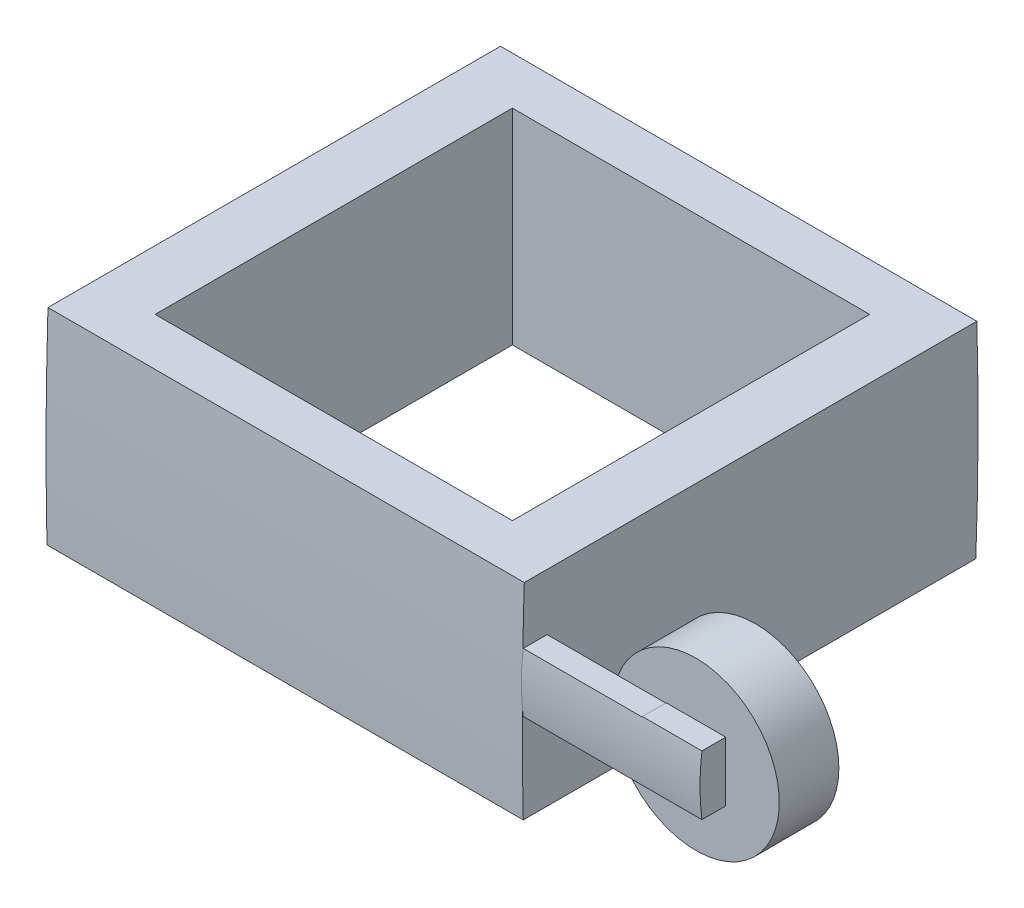
ISO-10303-21;
HEADER;
FILE_DESCRIPTION(('STEP AP214'),'2;1');
FILE_NAME('part.step','',(''),(''),'','','');
FILE_SCHEMA(('AUTOMOTIVE_DESIGN { 1 0 10303 214 1 1 1 1 }'));
ENDSEC;
DATA;
#1=APPLICATION_CONTEXT('core data for automotive mechanical design processes');
#2=APPLICATION_PROTOCOL_DEFINITION('international standard','automotive_design',2000,#1);
#3=PRODUCT_CONTEXT('',#1,'mechanical');
#4=PRODUCT('Part','Part','',(#3));
#5=PRODUCT_RELATED_PRODUCT_CATEGORY('part','',(#4));
#6=PRODUCT_DEFINITION_FORMATION('','',#4);
#7=PRODUCT_DEFINITION_CONTEXT('part definition',#1,'design');
#8=PRODUCT_DEFINITION('design','',#6,#7);
#9=PRODUCT_DEFINITION_SHAPE('','',#8);
#10=(LENGTH_UNIT() NAMED_UNIT(*) SI_UNIT(.MILLI.,.METRE.));
#11=(NAMED_UNIT(*) PLANE_ANGLE_UNIT() SI_UNIT($,.RADIAN.));
#12=(NAMED_UNIT(*) SI_UNIT($,.STERADIAN.) SOLID_ANGLE_UNIT());
#13=UNCERTAINTY_MEASURE_WITH_UNIT(LENGTH_MEASURE(1.E-05),#10,'distance_accuracy_value','');
#14=(GEOMETRIC_REPRESENTATION_CONTEXT(3) GLOBAL_UNCERTAINTY_ASSIGNED_CONTEXT((#13)) GLOBAL_UNIT_ASSIGNED_CONTEXT((#10,
#11,#12)) REPRESENTATION_CONTEXT('',''));
#15=CARTESIAN_POINT('',(0.,0.,0.));
#16=DIRECTION('',(0.,0.,1.));
#17=DIRECTION('',(1.,0.,0.));
#18=AXIS2_PLACEMENT_3D('',#15,#16,#17);
#19=CARTESIAN_POINT('',(0.,0.,10.));
#20=DIRECTION('',(0.,0.,1.));
#21=DIRECTION('',(1.,0.,0.));
#22=AXIS2_PLACEMENT_3D('',#19,#20,#21);
#23=PLANE('',#22);
#24=DIRECTION('',(1.,0.,0.));
#25=VECTOR('',#24,1.);
#26=CARTESIAN_POINT('',(-5.,-5.,10.));
#27=LINE('',#26,#25);
#28=CARTESIAN_POINT('',(-13.076696830622,-5.,10.));
#29=VERTEX_POINT('',#28);
#30=CARTESIAN_POINT('',(5.,-5.,10.));
#31=VERTEX_POINT('',#30);
#32=EDGE_CURVE('E260',#29,#31,#27,.T.);
#33=ORIENTED_EDGE('',*,*,#32,.F.);
#34=CARTESIAN_POINT('',(0.,0.,10.));
#35=DIRECTION('',(0.,0.,1.));
#36=DIRECTION('',(1.,0.,0.));
#37=AXIS2_PLACEMENT_3D('',#34,#35,#36);
#38=CIRCLE('',#37,14.);
#39=CARTESIAN_POINT('',(-13.1096817143984,4.91286528892942,10.));
#40=VERTEX_POINT('',#39);
#41=EDGE_CURVE('E280',#29,#40,#38,.T.);
#42=ORIENTED_EDGE('',*,*,#41,.T.);
#43=DIRECTION('',(1.,0.,0.));
#44=VECTOR('',#43,1.);
#45=CARTESIAN_POINT('',(-25.,4.91286528892942,10.));
#46=LINE('',#45,#44);
#47=CARTESIAN_POINT('',(-5.,4.91286528892942,10.));
#48=VERTEX_POINT('',#47);
#49=EDGE_CURVE('E243',#40,#48,#46,.T.);
#50=ORIENTED_EDGE('',*,*,#49,.T.);
#51=DIRECTION('',(0.,-1.,0.));
#52=VECTOR('',#51,1.);
#53=CARTESIAN_POINT('',(-5.,5.,10.));
#54=LINE('',#53,#52);
#55=CARTESIAN_POINT('',(-5.,5.,10.));
#56=VERTEX_POINT('',#55);
#57=EDGE_CURVE('E257',#56,#48,#54,.T.);
#58=ORIENTED_EDGE('',*,*,#57,.F.);
#59=DIRECTION('',(-1.,0.,0.));
#60=VECTOR('',#59,1.);
#61=CARTESIAN_POINT('',(-5.,5.,10.));
#62=LINE('',#61,#60);
#63=CARTESIAN_POINT('',(5.,5.,10.));
#64=VERTEX_POINT('',#63);
#65=EDGE_CURVE('E254',#64,#56,#62,.T.);
#66=ORIENTED_EDGE('',*,*,#65,.F.);
#67=DIRECTION('',(0.,1.,0.));
#68=VECTOR('',#67,1.);
#69=CARTESIAN_POINT('',(5.,5.,10.));
#70=LINE('',#69,#68);
#71=EDGE_CURVE('E251',#31,#64,#70,.T.);
#72=ORIENTED_EDGE('',*,*,#71,.F.);
#73=EDGE_LOOP('',(#33,#42,#50,#58,#66,#72));
#74=FACE_BOUND('',#73,.T.);
#75=ADVANCED_FACE('F32',(#74),#23,.T.);
#76=CARTESIAN_POINT('',(-5.,5.,18.));
#77=DIRECTION('',(1.,0.,0.));
#78=DIRECTION('',(0.,1.,0.));
#79=AXIS2_PLACEMENT_3D('',#76,#77,#78);
#80=PLANE('',#79);
#81=DIRECTION('',(0.,0.,-1.));
#82=VECTOR('',#81,1.);
#83=CARTESIAN_POINT('',(-5.,4.91286528892942,10.));
#84=LINE('',#83,#82);
#85=CARTESIAN_POINT('',(-5.,4.91286528892942,14.0114631277404));
#86=VERTEX_POINT('',#85);
#87=EDGE_CURVE('E233',#86,#48,#84,.T.);
#88=ORIENTED_EDGE('',*,*,#87,.F.);
#89=CARTESIAN_POINT('',(-5.,0.,-23.6696164036747));
#90=DIRECTION('',(1.,0.,0.));
#91=DIRECTION('',(0.,1.,0.));
#92=AXIS2_PLACEMENT_3D('',#89,#90,#91);
#93=CIRCLE('',#92,38.);
#94=CARTESIAN_POINT('',(-5.,5.,14.));
#95=VERTEX_POINT('',#94);
#96=EDGE_CURVE('E230',#86,#95,#93,.F.);
#97=ORIENTED_EDGE('',*,*,#96,.T.);
#98=DIRECTION('',(0.,0.,-1.));
#99=VECTOR('',#98,1.);
#100=CARTESIAN_POINT('',(-5.,5.,18.));
#101=LINE('',#100,#99);
#102=EDGE_CURVE('E265',#95,#56,#101,.T.);
#103=ORIENTED_EDGE('',*,*,#102,.T.);
#104=ORIENTED_EDGE('',*,*,#57,.T.);
#105=EDGE_LOOP('',(#88,#97,#103,#104));
#106=FACE_BOUND('',#105,.T.);
#107=ADVANCED_FACE('F311',(#106),#80,.F.);
#108=CARTESIAN_POINT('',(0.,0.,10.));
#109=DIRECTION('',(0.,0.,-1.));
#110=DIRECTION('',(-1.,0.,0.));
#111=AXIS2_PLACEMENT_3D('',#108,#109,#110);
#112=CYLINDRICAL_SURFACE('',#111,14.);
#113=EDGE_CURVE('E41',#40,#29,#38,.T.);
#114=ORIENTED_EDGE('',*,*,#113,.F.);
#115=ORIENTED_EDGE('',*,*,#41,.F.);
#116=EDGE_LOOP('',(#114,#115));
#117=FACE_BOUND('',#116,.T.);
#118=CARTESIAN_POINT('',(0.,0.,0.));
#119=DIRECTION('',(0.,0.,1.));
#120=DIRECTION('',(1.,0.,0.));
#121=AXIS2_PLACEMENT_3D('',#118,#119,#120);
#122=CIRCLE('',#121,14.);
#123=CARTESIAN_POINT('',(14.,0.,0.));
#124=VERTEX_POINT('',#123);
#125=EDGE_CURVE('E278',#124,#124,#122,.T.);
#126=ORIENTED_EDGE('',*,*,#125,.T.);
#127=EDGE_LOOP('',(#126));
#128=FACE_BOUND('',#127,.T.);
#129=ADVANCED_FACE('F34',(#117,#128),#112,.T.);
#130=CARTESIAN_POINT('',(0.,0.,0.));
#131=DIRECTION('',(0.,0.,1.));
#132=DIRECTION('',(1.,0.,0.));
#133=AXIS2_PLACEMENT_3D('',#130,#131,#132);
#134=PLANE('',#133);
#135=CARTESIAN_POINT('',(0.,0.,0.));
#136=DIRECTION('',(0.,0.,-1.));
#137=DIRECTION('',(-1.,0.,0.));
#138=AXIS2_PLACEMENT_3D('',#135,#136,#137);
#139=CIRCLE('',#138,5.);
#140=CARTESIAN_POINT('',(-5.,0.,0.));
#141=VERTEX_POINT('',#140);
#142=EDGE_CURVE('E269',#141,#141,#139,.T.);
#143=ORIENTED_EDGE('',*,*,#142,.F.);
#144=EDGE_LOOP('',(#143));
#145=FACE_BOUND('',#144,.T.);
#146=ORIENTED_EDGE('',*,*,#125,.F.);
#147=EDGE_LOOP('',(#146));
#148=FACE_BOUND('',#147,.T.);
#149=ADVANCED_FACE('F361',(#145,#148),#134,.F.);
#150=CARTESIAN_POINT('',(0.,0.,1.8));
#151=DIRECTION('',(0.,0.,-1.));
#152=DIRECTION('',(-1.,0.,0.));
#153=AXIS2_PLACEMENT_3D('',#150,#151,#152);
#154=PLANE('',#153);
#155=CARTESIAN_POINT('',(0.,0.,1.8));
#156=DIRECTION('',(0.,0.,-1.));
#157=DIRECTION('',(-1.,0.,0.));
#158=AXIS2_PLACEMENT_3D('',#155,#156,#157);
#159=CIRCLE('',#158,5.);
#160=CARTESIAN_POINT('',(-5.,0.,1.8));
#161=VERTEX_POINT('',#160);
#162=EDGE_CURVE('E270',#161,#161,#159,.T.);
#163=ORIENTED_EDGE('',*,*,#162,.T.);
#164=EDGE_LOOP('',(#163));
#165=FACE_BOUND('',#164,.T.);
#166=CARTESIAN_POINT('',(0.,0.,1.8));
#167=DIRECTION('',(0.,0.,-1.));
#168=DIRECTION('',(-1.,0.,0.));
#169=AXIS2_PLACEMENT_3D('',#166,#167,#168);
#170=CIRCLE('',#169,2.25);
#171=CARTESIAN_POINT('',(-2.25,0.,1.8));
#172=VERTEX_POINT('',#171);
#173=EDGE_CURVE('E36',#172,#172,#170,.F.);
#174=ORIENTED_EDGE('',*,*,#173,.T.);
#175=EDGE_LOOP('',(#174));
#176=FACE_BOUND('',#175,.T.);
#177=ADVANCED_FACE('F363',(#165,#176),#154,.T.);
#178=CARTESIAN_POINT('',(0.,0.,1.8));
#179=DIRECTION('',(0.,0.,-1.));
#180=DIRECTION('',(-1.,0.,0.));
#181=AXIS2_PLACEMENT_3D('',#178,#179,#180);
#182=CYLINDRICAL_SURFACE('',#181,5.);
#183=ORIENTED_EDGE('',*,*,#162,.F.);
#184=EDGE_LOOP('',(#183));
#185=FACE_BOUND('',#184,.T.);
#186=ORIENTED_EDGE('',*,*,#142,.T.);
#187=EDGE_LOOP('',(#186));
#188=FACE_BOUND('',#187,.T.);
#189=ADVANCED_FACE('F369',(#185,#188),#182,.F.);
#190=CARTESIAN_POINT('',(0.,0.,5.));
#191=DIRECTION('',(0.,0.,-1.));
#192=DIRECTION('',(-1.,0.,0.));
#193=AXIS2_PLACEMENT_3D('',#190,#191,#192);
#194=PLANE('',#193);
#195=CARTESIAN_POINT('',(0.,0.,5.));
#196=DIRECTION('',(0.,0.,-1.));
#197=DIRECTION('',(-1.,0.,0.));
#198=AXIS2_PLACEMENT_3D('',#195,#196,#197);
#199=CIRCLE('',#198,2.25);
#200=CARTESIAN_POINT('',(-2.25,0.,5.));
#201=VERTEX_POINT('',#200);
#202=EDGE_CURVE('E275',#201,#201,#199,.T.);
#203=ORIENTED_EDGE('',*,*,#202,.T.);
#204=EDGE_LOOP('',(#203));
#205=FACE_BOUND('',#204,.T.);
#206=ADVANCED_FACE('F376',(#205),#194,.T.);
#207=CARTESIAN_POINT('',(0.,0.,5.));
#208=DIRECTION('',(0.,0.,-1.));
#209=DIRECTION('',(-1.,0.,0.));
#210=AXIS2_PLACEMENT_3D('',#207,#208,#209);
#211=CYLINDRICAL_SURFACE('',#210,2.25);
#212=ORIENTED_EDGE('',*,*,#202,.F.);
#213=EDGE_LOOP('',(#212));
#214=FACE_BOUND('',#213,.T.);
#215=ORIENTED_EDGE('',*,*,#173,.F.);
#216=EDGE_LOOP('',(#215));
#217=FACE_BOUND('',#216,.T.);
#218=ADVANCED_FACE('F359',(#214,#217),#211,.F.);
#219=CARTESIAN_POINT('',(5.,5.,18.));
#220=DIRECTION('',(-1.,0.,0.));
#221=DIRECTION('',(0.,-1.,0.));
#222=AXIS2_PLACEMENT_3D('',#219,#220,#221);
#223=PLANE('',#222);
#224=DIRECTION('',(0.,0.,-1.));
#225=VECTOR('',#224,1.);
#226=CARTESIAN_POINT('',(5.,5.,18.));
#227=LINE('',#226,#225);
#228=CARTESIAN_POINT('',(5.,5.,14.));
#229=VERTEX_POINT('',#228);
#230=EDGE_CURVE('E267',#229,#64,#227,.T.);
#231=ORIENTED_EDGE('',*,*,#230,.F.);
#232=CARTESIAN_POINT('',(5.,0.,-23.6696164036747));
#233=DIRECTION('',(-1.,0.,0.));
#234=DIRECTION('',(0.,-1.,0.));
#235=AXIS2_PLACEMENT_3D('',#232,#233,#234);
#236=CIRCLE('',#235,38.);
#237=CARTESIAN_POINT('',(5.,-5.,14.));
#238=VERTEX_POINT('',#237);
#239=EDGE_CURVE('E215',#238,#229,#236,.T.);
#240=ORIENTED_EDGE('',*,*,#239,.F.);
#241=DIRECTION('',(0.,0.,-1.));
#242=VECTOR('',#241,1.);
#243=CARTESIAN_POINT('',(5.,-5.,18.));
#244=LINE('',#243,#242);
#245=EDGE_CURVE('E263',#238,#31,#244,.T.);
#246=ORIENTED_EDGE('',*,*,#245,.T.);
#247=ORIENTED_EDGE('',*,*,#71,.T.);
#248=EDGE_LOOP('',(#231,#240,#246,#247));
#249=FACE_BOUND('',#248,.T.);
#250=ADVANCED_FACE('F319',(#249),#223,.F.);
#251=CARTESIAN_POINT('',(-5.,5.,18.));
#252=DIRECTION('',(0.,-1.,0.));
#253=DIRECTION('',(0.,0.,-1.));
#254=AXIS2_PLACEMENT_3D('',#251,#252,#253);
#255=PLANE('',#254);
#256=ORIENTED_EDGE('',*,*,#102,.F.);
#257=DIRECTION('',(1.,0.,0.));
#258=VECTOR('',#257,1.);
#259=CARTESIAN_POINT('',(-25.,5.,14.));
#260=LINE('',#259,#258);
#261=EDGE_CURVE('E223',#95,#229,#260,.T.);
#262=ORIENTED_EDGE('',*,*,#261,.T.);
#263=ORIENTED_EDGE('',*,*,#230,.T.);
#264=ORIENTED_EDGE('',*,*,#65,.T.);
#265=EDGE_LOOP('',(#256,#262,#263,#264));
#266=FACE_BOUND('',#265,.T.);
#267=ADVANCED_FACE('F315',(#266),#255,.F.);
#268=CARTESIAN_POINT('',(-5.,-5.,18.));
#269=DIRECTION('',(0.,1.,0.));
#270=DIRECTION('',(0.,0.,1.));
#271=AXIS2_PLACEMENT_3D('',#268,#269,#270);
#272=PLANE('',#271);
#273=ORIENTED_EDGE('',*,*,#245,.F.);
#274=DIRECTION('',(1.,0.,0.));
#275=VECTOR('',#274,1.);
#276=CARTESIAN_POINT('',(-25.,-5.,14.));
#277=LINE('',#276,#275);
#278=CARTESIAN_POINT('',(-25.,-5.,14.));
#279=VERTEX_POINT('',#278);
#280=EDGE_CURVE('E219',#279,#238,#277,.T.);
#281=ORIENTED_EDGE('',*,*,#280,.F.);
#282=DIRECTION('',(0.,0.,1.));
#283=VECTOR('',#282,1.);
#284=CARTESIAN_POINT('',(-25.,-5.,10.));
#285=LINE('',#284,#283);
#286=CARTESIAN_POINT('',(-25.,-5.,10.));
#287=VERTEX_POINT('',#286);
#288=EDGE_CURVE('E237',#287,#279,#285,.T.);
#289=ORIENTED_EDGE('',*,*,#288,.F.);
#290=DIRECTION('',(1.,0.,0.));
#291=VECTOR('',#290,1.);
#292=CARTESIAN_POINT('',(-25.,-5.,10.));
#293=LINE('',#292,#291);
#294=EDGE_CURVE('E248',#287,#29,#293,.T.);
#295=ORIENTED_EDGE('',*,*,#294,.T.);
#296=ORIENTED_EDGE('',*,*,#32,.T.);
#297=EDGE_LOOP('',(#273,#281,#289,#295,#296));
#298=FACE_BOUND('',#297,.T.);
#299=ADVANCED_FACE('F298',(#298),#272,.F.);
#300=CARTESIAN_POINT('',(-25.,4.91286528892942,10.));
#301=DIRECTION('',(0.,0.,1.));
#302=DIRECTION('',(1.,0.,0.));
#303=AXIS2_PLACEMENT_3D('',#300,#301,#302);
#304=PLANE('',#303);
#305=CARTESIAN_POINT('',(-25.,4.91286528892942,10.));
#306=VERTEX_POINT('',#305);
#307=EDGE_CURVE('E245',#306,#40,#46,.T.);
#308=ORIENTED_EDGE('',*,*,#307,.T.);
#309=ORIENTED_EDGE('',*,*,#113,.T.);
#310=ORIENTED_EDGE('',*,*,#294,.F.);
#311=DIRECTION('',(0.,-1.,0.));
#312=VECTOR('',#311,1.);
#313=CARTESIAN_POINT('',(-25.,4.91286528892942,10.));
#314=LINE('',#313,#312);
#315=EDGE_CURVE('E234',#306,#287,#314,.T.);
#316=ORIENTED_EDGE('',*,*,#315,.F.);
#317=EDGE_LOOP('',(#308,#309,#310,#316));
#318=FACE_BOUND('',#317,.T.);
#319=ADVANCED_FACE('F294',(#318),#304,.F.);
#320=CARTESIAN_POINT('',(-25.,4.91286528892942,10.));
#321=DIRECTION('',(0.,-1.,0.));
#322=DIRECTION('',(1.,0.,0.));
#323=AXIS2_PLACEMENT_3D('',#320,#321,#322);
#324=PLANE('',#323);
#325=DIRECTION('',(0.,0.,-1.));
#326=VECTOR('',#325,1.);
#327=CARTESIAN_POINT('',(-25.,4.91286528892942,10.));
#328=LINE('',#327,#326);
#329=CARTESIAN_POINT('',(-25.,4.91286528892942,14.0114631277404));
#330=VERTEX_POINT('',#329);
#331=EDGE_CURVE('E240',#330,#306,#328,.T.);
#332=ORIENTED_EDGE('',*,*,#331,.F.);
#333=DIRECTION('',(1.,0.,0.));
#334=VECTOR('',#333,1.);
#335=CARTESIAN_POINT('',(-25.,4.91286528892942,14.0114631277404));
#336=LINE('',#335,#334);
#337=EDGE_CURVE('E226',#330,#86,#336,.T.);
#338=ORIENTED_EDGE('',*,*,#337,.T.);
#339=ORIENTED_EDGE('',*,*,#87,.T.);
#340=ORIENTED_EDGE('',*,*,#49,.F.);
#341=ORIENTED_EDGE('',*,*,#307,.F.);
#342=EDGE_LOOP('',(#332,#338,#339,#340,#341));
#343=FACE_BOUND('',#342,.T.);
#344=ADVANCED_FACE('F308',(#343),#324,.F.);
#345=CARTESIAN_POINT('',(-25.,0.,0.));
#346=DIRECTION('',(-1.,0.,0.));
#347=DIRECTION('',(0.,-1.,0.));
#348=AXIS2_PLACEMENT_3D('',#345,#346,#347);
#349=PLANE('',#348);
#350=CARTESIAN_POINT('',(-25.,-5.83938739683854,-602.069122819706));
#351=DIRECTION('',(-1.,0.,0.));
#352=DIRECTION('',(0.,1.,0.));
#353=AXIS2_PLACEMENT_3D('',#350,#351,#352);
#354=CIRCLE('',#353,616.232847891234);
#355=CARTESIAN_POINT('',(-25.,-3.5981456585402,14.1596493547289));
#356=VERTEX_POINT('',#355);
#357=CARTESIAN_POINT('',(-25.,4.36116541292893,14.0792939943893));
#358=VERTEX_POINT('',#357);
#359=EDGE_CURVE('E11',#356,#358,#354,.T.);
#360=ORIENTED_EDGE('',*,*,#359,.F.);
#361=CARTESIAN_POINT('',(-25.,0.,-23.6696164036747));
#362=DIRECTION('',(-1.,0.,0.));
#363=DIRECTION('',(0.,-1.,0.));
#364=AXIS2_PLACEMENT_3D('',#361,#362,#363);
#365=CIRCLE('',#364,38.);
#366=EDGE_CURVE('E220',#356,#358,#365,.T.);
#367=ORIENTED_EDGE('',*,*,#366,.T.);
#368=EDGE_LOOP('',(#360,#367));
#369=FACE_BOUND('',#368,.T.);
#370=ADVANCED_FACE('F324',(#369),#349,.T.);
#371=CARTESIAN_POINT('',(-25.,0.,-23.6696164036747));
#372=DIRECTION('',(1.,0.,0.));
#373=DIRECTION('',(0.,1.,0.));
#374=AXIS2_PLACEMENT_3D('',#371,#372,#373);
#375=CYLINDRICAL_SURFACE('',#374,38.);
#376=ORIENTED_EDGE('',*,*,#337,.F.);
#377=EDGE_CURVE('E221',#358,#330,#365,.T.);
#378=ORIENTED_EDGE('',*,*,#377,.F.);
#379=ORIENTED_EDGE('',*,*,#366,.F.);
#380=EDGE_CURVE('E216',#279,#356,#365,.T.);
#381=ORIENTED_EDGE('',*,*,#380,.F.);
#382=ORIENTED_EDGE('',*,*,#280,.T.);
#383=ORIENTED_EDGE('',*,*,#239,.T.);
#384=ORIENTED_EDGE('',*,*,#261,.F.);
#385=ORIENTED_EDGE('',*,*,#96,.F.);
#386=EDGE_LOOP('',(#376,#378,#379,#381,#382,#383,#384,#385));
#387=FACE_BOUND('',#386,.T.);
#388=ADVANCED_FACE('F321',(#387),#375,.T.);
#389=CARTESIAN_POINT('',(-105.,-0.220068821104443,468.323560821229));
#390=DIRECTION('',(1.,0.,0.));
#391=DIRECTION('',(0.,1.,0.));
#392=AXIS2_PLACEMENT_3D('',#389,#390,#391);
#393=CYLINDRICAL_SURFACE('',#392,530.693932748672);
#394=CARTESIAN_POINT('',(-25.,-0.220068821104429,468.323560821229));
#395=DIRECTION('',(-1.,0.,0.));
#396=DIRECTION('',(0.,1.,0.));
#397=AXIS2_PLACEMENT_3D('',#394,#395,#396);
#398=CIRCLE('',#397,530.693932748672);
#399=CARTESIAN_POINT('',(-25.,14.4035859028628,-62.1688509800772));
#400=VERTEX_POINT('',#399);
#401=CARTESIAN_POINT('',(-25.,-20.0435673555353,-62.0000000000001));
#402=VERTEX_POINT('',#401);
#403=EDGE_CURVE('E186',#400,#402,#398,.T.);
#404=ORIENTED_EDGE('',*,*,#403,.T.);
#405=DIRECTION('',(1.,0.,0.));
#406=VECTOR('',#405,1.);
#407=CARTESIAN_POINT('',(-105.,-20.0435673555353,-62.0000000000001));
#408=LINE('',#407,#406);
#409=CARTESIAN_POINT('',(-105.,-20.0435673555353,-62.0000000000001));
#410=VERTEX_POINT('',#409);
#411=EDGE_CURVE('E212',#410,#402,#408,.T.);
#412=ORIENTED_EDGE('',*,*,#411,.F.);
#413=CARTESIAN_POINT('',(-105.,-0.220068821104443,468.323560821229));
#414=DIRECTION('',(-1.,0.,0.));
#415=DIRECTION('',(0.,1.,0.));
#416=AXIS2_PLACEMENT_3D('',#413,#414,#415);
#417=CIRCLE('',#416,530.693932748672);
#418=CARTESIAN_POINT('',(-105.,14.4035859028628,-62.1688509800772));
#419=VERTEX_POINT('',#418);
#420=EDGE_CURVE('E187',#419,#410,#417,.T.);
#421=ORIENTED_EDGE('',*,*,#420,.F.);
#422=DIRECTION('',(1.,0.,0.));
#423=VECTOR('',#422,1.);
#424=CARTESIAN_POINT('',(-105.,14.4035859028628,-62.1688509800772));
#425=LINE('',#424,#423);
#426=EDGE_CURVE('E197',#419,#400,#425,.T.);
#427=ORIENTED_EDGE('',*,*,#426,.T.);
#428=EDGE_LOOP('',(#404,#412,#421,#427));
#429=FACE_BOUND('',#428,.T.);
#430=ADVANCED_FACE('F337',(#429),#393,.T.);
#431=CARTESIAN_POINT('',(-105.,-20.0435673555353,-62.0000000000001));
#432=DIRECTION('',(0.,1.,0.));
#433=DIRECTION('',(-1.,0.,0.));
#434=AXIS2_PLACEMENT_3D('',#431,#432,#433);
#435=PLANE('',#434);
#436=DIRECTION('',(-1.,0.,0.));
#437=VECTOR('',#436,1.);
#438=CARTESIAN_POINT('',(-105.,-20.0435673555353,-54.1688509800772));
#439=LINE('',#438,#437);
#440=CARTESIAN_POINT('',(-35.,-20.0435673555353,-54.1688509800772));
#441=VERTEX_POINT('',#440);
#442=CARTESIAN_POINT('',(-95.,-20.0435673555353,-54.1688509800772));
#443=VERTEX_POINT('',#442);
#444=EDGE_CURVE('E180',#441,#443,#439,.T.);
#445=ORIENTED_EDGE('',*,*,#444,.T.);
#446=DIRECTION('',(0.,0.,1.));
#447=VECTOR('',#446,1.);
#448=CARTESIAN_POINT('',(-95.,-20.0435673555353,-62.0000000000001));
#449=LINE('',#448,#447);
#450=CARTESIAN_POINT('',(-95.,-20.0435673555353,5.83114901992285));
#451=VERTEX_POINT('',#450);
#452=EDGE_CURVE('E183',#443,#451,#449,.T.);
#453=ORIENTED_EDGE('',*,*,#452,.T.);
#454=DIRECTION('',(1.,0.,0.));
#455=VECTOR('',#454,1.);
#456=CARTESIAN_POINT('',(-105.,-20.0435673555353,5.83114901992285));
#457=LINE('',#456,#455);
#458=CARTESIAN_POINT('',(-35.,-20.0435673555353,5.83114901992284));
#459=VERTEX_POINT('',#458);
#460=EDGE_CURVE('E175',#451,#459,#457,.T.);
#461=ORIENTED_EDGE('',*,*,#460,.T.);
#462=DIRECTION('',(0.,0.,-1.));
#463=VECTOR('',#462,1.);
#464=CARTESIAN_POINT('',(-35.,-20.0435673555353,-62.0000000000001));
#465=LINE('',#464,#463);
#466=EDGE_CURVE('E155',#459,#441,#465,.T.);
#467=ORIENTED_EDGE('',*,*,#466,.T.);
#468=EDGE_LOOP('',(#445,#453,#461,#467));
#469=FACE_BOUND('',#468,.T.);
#470=DIRECTION('',(0.,0.,1.));
#471=VECTOR('',#470,1.);
#472=CARTESIAN_POINT('',(-25.,-20.0435673555353,-62.0000000000001));
#473=LINE('',#472,#471);
#474=CARTESIAN_POINT('',(-25.,-20.0435673555353,14.));
#475=VERTEX_POINT('',#474);
#476=EDGE_CURVE('E200',#402,#475,#473,.T.);
#477=ORIENTED_EDGE('',*,*,#476,.T.);
#478=DIRECTION('',(1.,0.,0.));
#479=VECTOR('',#478,1.);
#480=CARTESIAN_POINT('',(-105.,-20.0435673555353,14.));
#481=LINE('',#480,#479);
#482=CARTESIAN_POINT('',(-105.,-20.0435673555353,14.));
#483=VERTEX_POINT('',#482);
#484=EDGE_CURVE('E209',#483,#475,#481,.T.);
#485=ORIENTED_EDGE('',*,*,#484,.F.);
#486=DIRECTION('',(0.,0.,1.));
#487=VECTOR('',#486,1.);
#488=CARTESIAN_POINT('',(-105.,-20.0435673555353,-62.0000000000001));
#489=LINE('',#488,#487);
#490=EDGE_CURVE('E190',#410,#483,#489,.T.);
#491=ORIENTED_EDGE('',*,*,#490,.F.);
#492=ORIENTED_EDGE('',*,*,#411,.T.);
#493=EDGE_LOOP('',(#477,#485,#491,#492));
#494=FACE_BOUND('',#493,.T.);
#495=ADVANCED_FACE('F334',(#469,#494),#435,.F.);
#496=CARTESIAN_POINT('',(-105.,-5.83938739683855,-602.069122819706));
#497=DIRECTION('',(1.,0.,0.));
#498=DIRECTION('',(0.,1.,0.));
#499=AXIS2_PLACEMENT_3D('',#496,#497,#498);
#500=CYLINDRICAL_SURFACE('',#499,616.232847891234);
#501=EDGE_CURVE('E43',#475,#356,#354,.T.);
#502=ORIENTED_EDGE('',*,*,#501,.T.);
#503=ORIENTED_EDGE('',*,*,#359,.T.);
#504=CARTESIAN_POINT('',(-25.,14.4035859028628,13.8311490199229));
#505=VERTEX_POINT('',#504);
#506=EDGE_CURVE('E44',#358,#505,#354,.T.);
#507=ORIENTED_EDGE('',*,*,#506,.T.);
#508=DIRECTION('',(1.,0.,0.));
#509=VECTOR('',#508,1.);
#510=CARTESIAN_POINT('',(-105.,14.4035859028628,13.8311490199229));
#511=LINE('',#510,#509);
#512=CARTESIAN_POINT('',(-105.,14.4035859028628,13.8311490199229));
#513=VERTEX_POINT('',#512);
#514=EDGE_CURVE('E206',#513,#505,#511,.T.);
#515=ORIENTED_EDGE('',*,*,#514,.F.);
#516=CARTESIAN_POINT('',(-105.,-5.83938739683855,-602.069122819706));
#517=DIRECTION('',(-1.,0.,0.));
#518=DIRECTION('',(0.,1.,0.));
#519=AXIS2_PLACEMENT_3D('',#516,#517,#518);
#520=CIRCLE('',#519,616.232847891234);
#521=EDGE_CURVE('E193',#483,#513,#520,.T.);
#522=ORIENTED_EDGE('',*,*,#521,.F.);
#523=ORIENTED_EDGE('',*,*,#484,.T.);
#524=EDGE_LOOP('',(#502,#503,#507,#515,#522,#523));
#525=FACE_BOUND('',#524,.T.);
#526=ADVANCED_FACE('F326',(#525),#500,.T.);
#527=CARTESIAN_POINT('',(-105.,14.4035859028628,-62.1688509800772));
#528=DIRECTION('',(0.,-1.,0.));
#529=DIRECTION('',(1.,0.,0.));
#530=AXIS2_PLACEMENT_3D('',#527,#528,#529);
#531=PLANE('',#530);
#532=DIRECTION('',(1.,0.,0.));
#533=VECTOR('',#532,1.);
#534=CARTESIAN_POINT('',(-35.,14.4035859028628,5.83114901992284));
#535=LINE('',#534,#533);
#536=CARTESIAN_POINT('',(-95.,14.4035859028628,5.83114901992285));
#537=VERTEX_POINT('',#536);
#538=CARTESIAN_POINT('',(-35.,14.4035859028628,5.83114901992284));
#539=VERTEX_POINT('',#538);
#540=EDGE_CURVE('E161',#537,#539,#535,.T.);
#541=ORIENTED_EDGE('',*,*,#540,.F.);
#542=DIRECTION('',(0.,0.,1.));
#543=VECTOR('',#542,1.);
#544=CARTESIAN_POINT('',(-95.,14.4035859028628,5.83114901992285));
#545=LINE('',#544,#543);
#546=CARTESIAN_POINT('',(-95.,14.4035859028628,-54.1688509800772));
#547=VERTEX_POINT('',#546);
#548=EDGE_CURVE('E59',#547,#537,#545,.T.);
#549=ORIENTED_EDGE('',*,*,#548,.F.);
#550=DIRECTION('',(-1.,0.,0.));
#551=VECTOR('',#550,1.);
#552=CARTESIAN_POINT('',(-35.,14.4035859028628,-54.1688509800772));
#553=LINE('',#552,#551);
#554=CARTESIAN_POINT('',(-35.,14.4035859028628,-54.1688509800772));
#555=VERTEX_POINT('',#554);
#556=EDGE_CURVE('E168',#555,#547,#553,.T.);
#557=ORIENTED_EDGE('',*,*,#556,.F.);
#558=DIRECTION('',(0.,0.,-1.));
#559=VECTOR('',#558,1.);
#560=CARTESIAN_POINT('',(-35.,14.4035859028628,5.83114901992284));
#561=LINE('',#560,#559);
#562=EDGE_CURVE('E152',#539,#555,#561,.T.);
#563=ORIENTED_EDGE('',*,*,#562,.F.);
#564=EDGE_LOOP('',(#541,#549,#557,#563));
#565=FACE_BOUND('',#564,.T.);
#566=DIRECTION('',(0.,0.,-1.));
#567=VECTOR('',#566,1.);
#568=CARTESIAN_POINT('',(-25.,14.4035859028628,-62.1688509800772));
#569=LINE('',#568,#567);
#570=EDGE_CURVE('E191',#505,#400,#569,.T.);
#571=ORIENTED_EDGE('',*,*,#570,.T.);
#572=ORIENTED_EDGE('',*,*,#426,.F.);
#573=DIRECTION('',(0.,0.,-1.));
#574=VECTOR('',#573,1.);
#575=CARTESIAN_POINT('',(-105.,14.4035859028628,-62.1688509800772));
#576=LINE('',#575,#574);
#577=EDGE_CURVE('E195',#513,#419,#576,.T.);
#578=ORIENTED_EDGE('',*,*,#577,.F.);
#579=ORIENTED_EDGE('',*,*,#514,.T.);
#580=EDGE_LOOP('',(#571,#572,#578,#579));
#581=FACE_BOUND('',#580,.T.);
#582=ADVANCED_FACE('F165',(#565,#581),#531,.F.);
#583=CARTESIAN_POINT('',(-105.,-0.220068821104443,468.323560821229));
#584=DIRECTION('',(1.,0.,0.));
#585=DIRECTION('',(0.,1.,0.));
#586=AXIS2_PLACEMENT_3D('',#583,#584,#585);
#587=PLANE('',#586);
#588=ORIENTED_EDGE('',*,*,#420,.T.);
#589=ORIENTED_EDGE('',*,*,#490,.T.);
#590=ORIENTED_EDGE('',*,*,#521,.T.);
#591=ORIENTED_EDGE('',*,*,#577,.T.);
#592=EDGE_LOOP('',(#588,#589,#590,#591));
#593=FACE_BOUND('',#592,.T.);
#594=ADVANCED_FACE('F341',(#593),#587,.F.);
#595=CARTESIAN_POINT('',(-25.,-0.220068821104429,468.323560821229));
#596=DIRECTION('',(1.,0.,0.));
#597=DIRECTION('',(0.,1.,0.));
#598=AXIS2_PLACEMENT_3D('',#595,#596,#597);
#599=PLANE('',#598);
#600=ORIENTED_EDGE('',*,*,#288,.T.);
#601=ORIENTED_EDGE('',*,*,#380,.T.);
#602=ORIENTED_EDGE('',*,*,#501,.F.);
#603=ORIENTED_EDGE('',*,*,#476,.F.);
#604=ORIENTED_EDGE('',*,*,#403,.F.);
#605=ORIENTED_EDGE('',*,*,#570,.F.);
#606=ORIENTED_EDGE('',*,*,#506,.F.);
#607=ORIENTED_EDGE('',*,*,#377,.T.);
#608=ORIENTED_EDGE('',*,*,#331,.T.);
#609=ORIENTED_EDGE('',*,*,#315,.T.);
#610=EDGE_LOOP('',(#600,#601,#602,#603,#604,#605,#606,#607,#608,#609));
#611=FACE_BOUND('',#610,.T.);
#612=ADVANCED_FACE('F301',(#611),#599,.T.);
#613=CARTESIAN_POINT('',(-95.,-85.5964140971372,5.83114901992285));
#614=DIRECTION('',(-1.,0.,0.));
#615=DIRECTION('',(0.,-1.,0.));
#616=AXIS2_PLACEMENT_3D('',#613,#614,#615);
#617=PLANE('',#616);
#618=DIRECTION('',(0.,1.,0.));
#619=VECTOR('',#618,1.);
#620=CARTESIAN_POINT('',(-95.,-85.5964140971372,-54.1688509800772));
#621=LINE('',#620,#619);
#622=EDGE_CURVE('E173',#443,#547,#621,.T.);
#623=ORIENTED_EDGE('',*,*,#622,.T.);
#624=ORIENTED_EDGE('',*,*,#548,.T.);
#625=DIRECTION('',(0.,1.,0.));
#626=VECTOR('',#625,1.);
#627=CARTESIAN_POINT('',(-95.,-85.5964140971372,5.83114901992285));
#628=LINE('',#627,#626);
#629=EDGE_CURVE('E158',#451,#537,#628,.T.);
#630=ORIENTED_EDGE('',*,*,#629,.F.);
#631=ORIENTED_EDGE('',*,*,#452,.F.);
#632=EDGE_LOOP('',(#623,#624,#630,#631));
#633=FACE_BOUND('',#632,.T.);
#634=ADVANCED_FACE('F348',(#633),#617,.F.);
#635=CARTESIAN_POINT('',(-35.,-85.5964140971372,-54.1688509800772));
#636=DIRECTION('',(0.,0.,-1.));
#637=DIRECTION('',(-1.,0.,0.));
#638=AXIS2_PLACEMENT_3D('',#635,#636,#637);
#639=PLANE('',#638);
#640=DIRECTION('',(0.,1.,0.));
#641=VECTOR('',#640,1.);
#642=CARTESIAN_POINT('',(-35.,-85.5964140971372,-54.1688509800772));
#643=LINE('',#642,#641);
#644=EDGE_CURVE('E157',#441,#555,#643,.T.);
#645=ORIENTED_EDGE('',*,*,#644,.T.);
#646=ORIENTED_EDGE('',*,*,#556,.T.);
#647=ORIENTED_EDGE('',*,*,#622,.F.);
#648=ORIENTED_EDGE('',*,*,#444,.F.);
#649=EDGE_LOOP('',(#645,#646,#647,#648));
#650=FACE_BOUND('',#649,.T.);
#651=ADVANCED_FACE('F427',(#650),#639,.F.);
#652=CARTESIAN_POINT('',(-35.,-85.5964140971372,5.83114901992284));
#653=DIRECTION('',(1.,0.,0.));
#654=DIRECTION('',(0.,1.,0.));
#655=AXIS2_PLACEMENT_3D('',#652,#653,#654);
#656=PLANE('',#655);
#657=DIRECTION('',(0.,1.,0.));
#658=VECTOR('',#657,1.);
#659=CARTESIAN_POINT('',(-35.,-85.5964140971372,5.83114901992284));
#660=LINE('',#659,#658);
#661=EDGE_CURVE('E51',#459,#539,#660,.T.);
#662=ORIENTED_EDGE('',*,*,#661,.T.);
#663=ORIENTED_EDGE('',*,*,#562,.T.);
#664=ORIENTED_EDGE('',*,*,#644,.F.);
#665=ORIENTED_EDGE('',*,*,#466,.F.);
#666=EDGE_LOOP('',(#662,#663,#664,#665));
#667=FACE_BOUND('',#666,.T.);
#668=ADVANCED_FACE('F149',(#667),#656,.F.);
#669=CARTESIAN_POINT('',(-35.,-85.5964140971372,5.83114901992284));
#670=DIRECTION('',(0.,0.,1.));
#671=DIRECTION('',(1.,0.,0.));
#672=AXIS2_PLACEMENT_3D('',#669,#670,#671);
#673=PLANE('',#672);
#674=ORIENTED_EDGE('',*,*,#629,.T.);
#675=ORIENTED_EDGE('',*,*,#540,.T.);
#676=ORIENTED_EDGE('',*,*,#661,.F.);
#677=ORIENTED_EDGE('',*,*,#460,.F.);
#678=EDGE_LOOP('',(#674,#675,#676,#677));
#679=FACE_BOUND('',#678,.T.);
#680=ADVANCED_FACE('F162',(#679),#673,.F.);
#681=CLOSED_SHELL('',(#75,#107,#129,#149,#177,#189,#206,#218,#250,#267,#299,#319,#344,#370,#388,
#430,#495,#526,#582,#594,#612,#634,#651,#668,#680));
#682=MANIFOLD_SOLID_BREP('B2',#681);
#683=ADVANCED_BREP_SHAPE_REPRESENTATION('',(#18,#682),#14);
#684=SHAPE_DEFINITION_REPRESENTATION(#9,#683);
ENDSEC;
END-ISO-10303-21;
